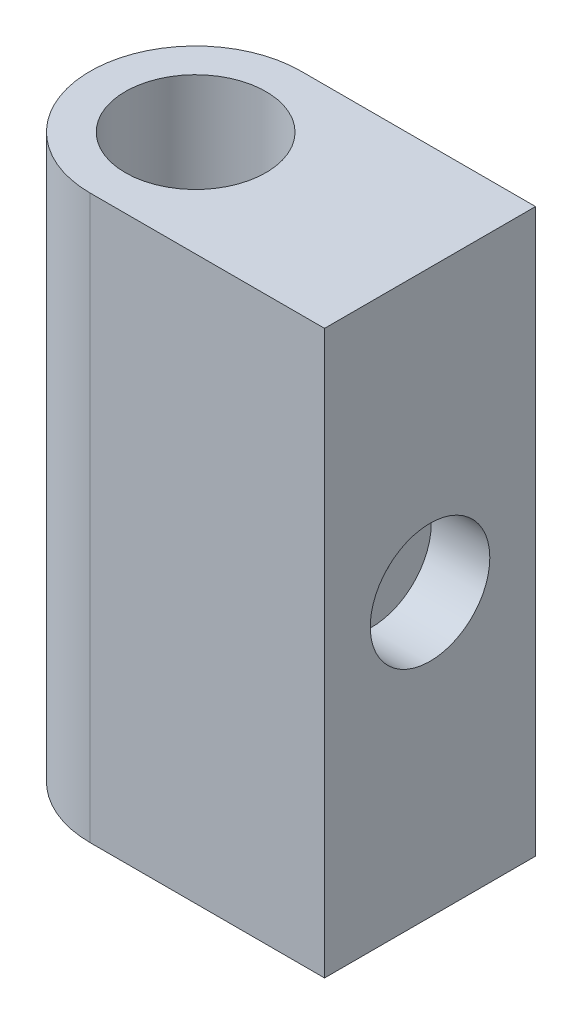
ISO-10303-21;
HEADER;
FILE_DESCRIPTION(('STEP AP214'),'2;1');
FILE_NAME('part.step','',(''),(''),'','','');
FILE_SCHEMA(('AUTOMOTIVE_DESIGN { 1 0 10303 214 1 1 1 1 }'));
ENDSEC;
DATA;
#1=APPLICATION_CONTEXT('core data for automotive mechanical design processes');
#2=APPLICATION_PROTOCOL_DEFINITION('international standard','automotive_design',2000,#1);
#3=PRODUCT_CONTEXT('',#1,'mechanical');
#4=PRODUCT('Part','Part','',(#3));
#5=PRODUCT_RELATED_PRODUCT_CATEGORY('part','',(#4));
#6=PRODUCT_DEFINITION_FORMATION('','',#4);
#7=PRODUCT_DEFINITION_CONTEXT('part definition',#1,'design');
#8=PRODUCT_DEFINITION('design','',#6,#7);
#9=PRODUCT_DEFINITION_SHAPE('','',#8);
#10=(LENGTH_UNIT() NAMED_UNIT(*) SI_UNIT(.MILLI.,.METRE.));
#11=(NAMED_UNIT(*) PLANE_ANGLE_UNIT() SI_UNIT($,.RADIAN.));
#12=(NAMED_UNIT(*) SI_UNIT($,.STERADIAN.) SOLID_ANGLE_UNIT());
#13=UNCERTAINTY_MEASURE_WITH_UNIT(LENGTH_MEASURE(1.E-05),#10,'distance_accuracy_value','');
#14=(GEOMETRIC_REPRESENTATION_CONTEXT(3) GLOBAL_UNCERTAINTY_ASSIGNED_CONTEXT((#13)) GLOBAL_UNIT_ASSIGNED_CONTEXT((#10,
#11,#12)) REPRESENTATION_CONTEXT('',''));
#15=CARTESIAN_POINT('',(0.,0.,0.));
#16=DIRECTION('',(0.,0.,1.));
#17=DIRECTION('',(1.,0.,0.));
#18=AXIS2_PLACEMENT_3D('',#15,#16,#17);
#19=CARTESIAN_POINT('',(0.,24.,0.));
#20=DIRECTION('',(0.,-1.,0.));
#21=DIRECTION('',(0.,0.,-1.));
#22=AXIS2_PLACEMENT_3D('',#19,#20,#21);
#23=CYLINDRICAL_SURFACE('',#22,3.);
#24=CARTESIAN_POINT('',(-1.58034806292791,12.,-2.55));
#25=CARTESIAN_POINT('',(-1.58036419946304,12.0869725091704,-2.54999414015116));
#26=CARTESIAN_POINT('',(-1.58769200710963,12.1741005734038,-2.54549174985861));
#27=CARTESIAN_POINT('',(-1.61542047962823,12.3454475487339,-2.52797552720362));
#28=CARTESIAN_POINT('',(-1.63586828604957,12.4296548103595,-2.51493099853644));
#29=CARTESIAN_POINT('',(-1.69662204343711,12.6270090888929,-2.4745219515144));
#30=CARTESIAN_POINT('',(-1.74162954326825,12.7379049501454,-2.44348254583797));
#31=CARTESIAN_POINT('',(-1.84180565920776,12.9505879350427,-2.36889651605155));
#32=CARTESIAN_POINT('',(-1.89700858715657,13.0523425223376,-2.32530737143315));
#33=CARTESIAN_POINT('',(-1.99738561764703,13.2229006789919,-2.23912482480946));
#34=CARTESIAN_POINT('',(-2.04159630272722,13.293561427916,-2.19903097305648));
#35=CARTESIAN_POINT('',(-2.13091018546103,13.430371461536,-2.11260324428197));
#36=CARTESIAN_POINT('',(-2.17601379550124,13.496518595858,-2.06626642382836));
#37=CARTESIAN_POINT('',(-2.31058712712745,13.688088145622,-1.91805105316987));
#38=CARTESIAN_POINT('',(-2.39951069021299,13.8069435879324,-1.80681277790663));
#39=CARTESIAN_POINT('',(-2.54873390809855,14.0003398401179,-1.58669773140099));
#40=CARTESIAN_POINT('',(-2.61103205522998,14.0788811543696,-1.4826625264938));
#41=CARTESIAN_POINT('',(-2.72551840222895,14.2209759051142,-1.25982347431062));
#42=CARTESIAN_POINT('',(-2.77772328201815,14.2845541077836,-1.14104453509618));
#43=CARTESIAN_POINT('',(-2.85987176343248,14.3836909558693,-0.912752643459822));
#44=CARTESIAN_POINT('',(-2.89212575672781,14.4222255216267,-0.805371360353293));
#45=CARTESIAN_POINT('',(-2.94486514313745,14.4849592886032,-0.583706489382501));
#46=CARTESIAN_POINT('',(-2.96535742739156,14.5091668841982,-0.46942698662763));
#47=CARTESIAN_POINT('',(-2.99297459214551,14.5417459502923,-0.236462337388017));
#48=CARTESIAN_POINT('',(-3.00003807979009,14.55004469121,-0.11775947462491));
#49=CARTESIAN_POINT('',(-2.99996162742121,14.5499549643238,0.119634171932145));
#50=CARTESIAN_POINT('',(-2.99282285098439,14.5415678635737,0.238324955918959));
#51=CARTESIAN_POINT('',(-2.96604164193072,14.5099731765271,0.463106167211607));
#52=CARTESIAN_POINT('',(-2.947363654086,14.487908331378,0.5694790400445));
#53=CARTESIAN_POINT('',(-2.89974014744232,14.4313012459549,0.776395076543693));
#54=CARTESIAN_POINT('',(-2.87079301529632,14.39675704508,0.876937321292325));
#55=CARTESIAN_POINT('',(-2.80172775890691,14.3136034210915,1.07820310125159));
#56=CARTESIAN_POINT('',(-2.76090639504525,14.2640966217854,1.17831015725028));
#57=CARTESIAN_POINT('',(-2.67164781377624,14.1543471329336,1.36871846861362));
#58=CARTESIAN_POINT('',(-2.62320464903093,14.0940960546218,1.45901197258852));
#59=CARTESIAN_POINT('',(-2.49549979742238,13.9322640083117,1.67168351645875));
#60=CARTESIAN_POINT('',(-2.41286445760448,13.8250003048137,1.78778005471743));
#61=CARTESIAN_POINT('',(-2.2853754061416,13.6513534831431,1.94464473600653));
#62=CARTESIAN_POINT('',(-2.24221904718785,13.59124137233,1.99411707100559));
#63=CARTESIAN_POINT('',(-2.15572260136032,13.4668447521452,2.08731763547995));
#64=CARTESIAN_POINT('',(-2.11238257819503,13.4025615939815,2.13104771141208));
#65=CARTESIAN_POINT('',(-2.00341502942419,13.2338370120478,2.23486793549749));
#66=CARTESIAN_POINT('',(-1.93843078553244,13.1265035682892,2.29098977210039));
#67=CARTESIAN_POINT('',(-1.81673475238016,12.9011226628781,2.38861834248635));
#68=CARTESIAN_POINT('',(-1.75999857974311,12.7831085267448,2.43016868978984));
#69=CARTESIAN_POINT('',(-1.68262391811637,12.5820188972546,2.48397281337336));
#70=CARTESIAN_POINT('',(-1.65643633785241,12.5025113099591,2.5013671315381));
#71=CARTESIAN_POINT('',(-1.61452027297985,12.3396034786515,2.52862718403891));
#72=CARTESIAN_POINT('',(-1.59876536247897,12.2562136468981,2.53851194946551));
#73=CARTESIAN_POINT('',(-1.58046035294427,12.086533908819,2.54995778816851));
#74=CARTESIAN_POINT('',(-1.57803571217018,12.000224115949,2.55143978255321));
#75=CARTESIAN_POINT('',(-1.58729052403136,11.8286319393117,2.54568781964496));
#76=CARTESIAN_POINT('',(-1.5989848560661,11.7433507352587,2.53844466730019));
#77=CARTESIAN_POINT('',(-1.63762205697747,11.5595749372591,2.51372173146763));
#78=CARTESIAN_POINT('',(-1.66717049711732,11.4618961902746,2.49446793201393));
#79=CARTESIAN_POINT('',(-1.7372930706236,11.2730454269352,2.44614212051156));
#80=CARTESIAN_POINT('',(-1.77790556207432,11.1818974672042,2.41703586410694));
#81=CARTESIAN_POINT('',(-1.85758829228604,11.0217146473851,2.3561469015554));
#82=CARTESIAN_POINT('',(-1.89565321826205,10.9516260569603,2.32575580449646));
#83=CARTESIAN_POINT('',(-1.97420442866811,10.8154838425205,2.25945976381318));
#84=CARTESIAN_POINT('',(-2.01469216211731,10.7494326818977,2.22355149997803));
#85=CARTESIAN_POINT('',(-2.09673763928908,10.6211462784056,2.14636211454001));
#86=CARTESIAN_POINT('',(-2.1382964334115,10.5589150009447,2.10507554400835));
#87=CARTESIAN_POINT('',(-2.2213967969776,10.4382654806659,2.01719020935599));
#88=CARTESIAN_POINT('',(-2.26293835441963,10.3798486522877,1.97058949208585));
#89=CARTESIAN_POINT('',(-2.34681121968081,10.2645897475262,1.87001151965115));
#90=CARTESIAN_POINT('',(-2.38910261925241,10.2079163738974,1.81580691257294));
#91=CARTESIAN_POINT('',(-2.47173984533933,10.0991458436709,1.7016084076666));
#92=CARTESIAN_POINT('',(-2.51208560639351,10.0470488409972,1.64161431525436));
#93=CARTESIAN_POINT('',(-2.58981236785219,9.94803381327182,1.51601725397902));
#94=CARTESIAN_POINT('',(-2.62720112576859,9.90110210135649,1.45042996751646));
#95=CARTESIAN_POINT('',(-2.69819604405755,9.81289101380707,1.31365125102563));
#96=CARTESIAN_POINT('',(-2.73180258431981,9.77161107041339,1.24246038504927));
#97=CARTESIAN_POINT('',(-2.80581326097518,9.6813837759313,1.06744707233282));
#98=CARTESIAN_POINT('',(-2.84415803025659,9.63521746106715,0.961267909894656));
#99=CARTESIAN_POINT('',(-2.90944425508272,9.55708670209745,0.740513735336554));
#100=CARTESIAN_POINT('',(-2.93639420295874,9.52511168061994,0.625945050736741));
#101=CARTESIAN_POINT('',(-2.97690522374502,9.47717782967745,0.390366991179606));
#102=CARTESIAN_POINT('',(-2.99038231223116,9.46131945490541,0.269322110848776));
#103=CARTESIAN_POINT('',(-3.00237107187923,9.44720795639877,0.0254776354400765));
#104=CARTESIAN_POINT('',(-3.00088785385781,9.44894882032243,-0.0973213460775337));
#105=CARTESIAN_POINT('',(-2.9839861115335,9.46885506259117,-0.328605422681673));
#106=CARTESIAN_POINT('',(-2.96991627209262,9.48543091284201,-0.437334737828452));
#107=CARTESIAN_POINT('',(-2.93076455520893,9.53179533902028,-0.649847757544597));
#108=CARTESIAN_POINT('',(-2.90568030624366,9.56158676041845,-0.753630391702031));
#109=CARTESIAN_POINT('',(-2.84480815407995,9.63444420332164,-0.958650140944277));
#110=CARTESIAN_POINT('',(-2.80859404467026,9.67804140667555,-1.05956906719022));
#111=CARTESIAN_POINT('',(-2.72808552575181,9.77610106540937,-1.25239532453187));
#112=CARTESIAN_POINT('',(-2.68378908412909,9.83056625361374,-1.34430038034483));
#113=CARTESIAN_POINT('',(-2.56635023104855,9.97726383497921,-1.56057255798071));
#114=CARTESIAN_POINT('',(-2.48958867143125,10.0750533807082,-1.67926106819597));
#115=CARTESIAN_POINT('',(-2.36943982687193,10.2342296507669,-1.84128567841008));
#116=CARTESIAN_POINT('',(-2.32844452670079,10.2895278989737,-1.89273671361723));
#117=CARTESIAN_POINT('',(-2.24563211718664,10.4040878012147,-1.99028052399672));
#118=CARTESIAN_POINT('',(-2.2038153496649,10.4633478303853,-2.03637547490268));
#119=CARTESIAN_POINT('',(-2.1194644097822,10.5869490016322,-2.12406363791348));
#120=CARTESIAN_POINT('',(-2.07693244367124,10.6513675669709,-2.16554952986191));
#121=CARTESIAN_POINT('',(-1.99314178431981,10.7843578337757,-2.2429077721262));
#122=CARTESIAN_POINT('',(-1.95188383787031,10.8529319038384,-2.2787768783834));
#123=CARTESIAN_POINT('',(-1.87239695227093,10.9941343811611,-2.34452026911305));
#124=CARTESIAN_POINT('',(-1.83415548087513,11.0667436158594,-2.37442024354952));
#125=CARTESIAN_POINT('',(-1.76267518771744,11.2165179415909,-2.4279551217156));
#126=CARTESIAN_POINT('',(-1.72942889323598,11.2936759819471,-2.45159942499794));
#127=CARTESIAN_POINT('',(-1.67093547176011,11.4523391728683,-2.49183280294748));
#128=CARTESIAN_POINT('',(-1.64564725353428,11.5338193663779,-2.50845827650457));
#129=CARTESIAN_POINT('',(-1.60646359524536,11.700526818483,-2.53374112382543));
#130=CARTESIAN_POINT('',(-1.592519180622,11.7857362776074,-2.5424327703482));
#131=CARTESIAN_POINT('',(-1.58382391207498,11.8929524331979,-2.54784269146493));
#132=CARTESIAN_POINT('',(-1.58252438633713,11.9143282797017,-2.54865023577574));
#133=CARTESIAN_POINT('',(-1.58078436228831,11.9571329254987,-2.54972968127438));
#134=CARTESIAN_POINT('',(-1.58034408535745,11.9785617370146,-2.55000144442171));
#135=CARTESIAN_POINT('',(-1.58034806292791,12.,-2.55));
#136=B_SPLINE_CURVE_WITH_KNOTS('',3,(#24,#25,#26,#27,#28,#29,#30,#31,#32,#33,#34,#35,#36,#37,
#38,#39,#40,#41,#42,#43,#44,#45,#46,#47,#48,#49,#50,#51,#52,#53,#54,#55,#56,#57,#58,#59,#60,#61,
#62,#63,#64,#65,#66,#67,#68,#69,#70,#71,#72,#73,#74,#75,#76,#77,#78,#79,#80,#81,#82,#83,#84,#85,
#86,#87,#88,#89,#90,#91,#92,#93,#94,#95,#96,#97,#98,#99,#100,#101,#102,#103,#104,#105,#106,#107,
#108,#109,#110,#111,#112,#113,#114,#115,#116,#117,#118,#119,#120,#121,#122,#123,#124,#125,#126,
#127,#128,#129,#130,#131,#132,#133,#134,#135),.UNSPECIFIED.,.T.,.F.,(4,2,2,2,2,2,2,2,2,2,2,2,2,
2,2,2,2,2,2,2,2,2,2,2,2,2,2,2,2,2,2,2,2,2,2,2,2,2,2,2,2,2,2,2,2,2,2,2,2,2,2,2,2,2,2,4),(0.,
0.260819128326951,0.52258069575937,0.891410874326817,1.26150571814708,1.53864791160456,
1.81592123220816,2.36930574695163,2.80121725762468,3.23240878231247,3.58661852041184,
3.94062051599184,4.29623705803741,4.65182446599129,4.98109624827447,5.31041978414753,
5.66582934377591,6.02151761979384,6.55351452111874,6.82035359373294,7.08710665146988,
7.49834657584164,7.90834490812674,8.16402802886294,8.4190610028104,8.67649017084262,
8.93419086976233,9.24400938072309,9.55491598301231,9.81064836850566,10.0665352599998,
10.3226834445184,10.578926078445,10.8459117516694,11.1129064013865,11.3791756175755,
11.6454180655064,12.0097823154592,12.3738745313499,12.7402224592469,13.1064452377258,
13.4375820691386,13.7687902329088,14.1147202205119,14.4607373042961,14.9733716246835,
15.2310094682785,15.4885422863397,15.7511789207504,16.0139666898012,16.2755978607065,
16.5368336519929,16.7966975471968,17.0554334883908,17.1197074648628,17.1839979989411),.UNSPECIFIED.);
#137=CARTESIAN_POINT('',(-1.58034806292791,12.,-2.55));
#138=VERTEX_POINT('',#137);
#139=EDGE_CURVE('E182',#138,#138,#136,.T.);
#140=ORIENTED_EDGE('',*,*,#139,.F.);
#141=EDGE_LOOP('',(#140));
#142=FACE_BOUND('',#141,.T.);
#143=CARTESIAN_POINT('',(0.,0.,0.));
#144=DIRECTION('',(0.,1.,0.));
#145=DIRECTION('',(0.,0.,1.));
#146=AXIS2_PLACEMENT_3D('',#143,#144,#145);
#147=CIRCLE('',#146,3.);
#148=CARTESIAN_POINT('',(0.,0.,3.));
#149=VERTEX_POINT('',#148);
#150=EDGE_CURVE('E122',#149,#149,#147,.T.);
#151=ORIENTED_EDGE('',*,*,#150,.F.);
#152=EDGE_LOOP('',(#151));
#153=FACE_BOUND('',#152,.T.);
#154=CARTESIAN_POINT('',(0.,24.,0.));
#155=DIRECTION('',(0.,1.,0.));
#156=DIRECTION('',(0.,0.,1.));
#157=AXIS2_PLACEMENT_3D('',#154,#155,#156);
#158=CIRCLE('',#157,3.);
#159=CARTESIAN_POINT('',(0.,24.,3.));
#160=VERTEX_POINT('',#159);
#161=EDGE_CURVE('E107',#160,#160,#158,.T.);
#162=ORIENTED_EDGE('',*,*,#161,.T.);
#163=EDGE_LOOP('',(#162));
#164=FACE_BOUND('',#163,.T.);
#165=CARTESIAN_POINT('',(1.58034806292791,12.,2.55));
#166=CARTESIAN_POINT('',(1.58036419946304,11.9130274908296,2.54999414015116));
#167=CARTESIAN_POINT('',(1.58769200710963,11.8258994265962,2.54549174985861));
#168=CARTESIAN_POINT('',(1.61542047962822,11.6545524512661,2.52797552720362));
#169=CARTESIAN_POINT('',(1.63586828604957,11.5703451896405,2.51493099853644));
#170=CARTESIAN_POINT('',(1.6966220434371,11.3729909111072,2.47452195151441));
#171=CARTESIAN_POINT('',(1.74162954326825,11.2620950498546,2.44348254583797));
#172=CARTESIAN_POINT('',(1.84180565920776,11.0494120649573,2.36889651605155));
#173=CARTESIAN_POINT('',(1.89700858715657,10.9476574776624,2.32530737143315));
#174=CARTESIAN_POINT('',(1.99738561764703,10.7770993210081,2.23912482480947));
#175=CARTESIAN_POINT('',(2.04159630272722,10.706438572084,2.19903097305648));
#176=CARTESIAN_POINT('',(2.13091018546102,10.569628538464,2.11260324428197));
#177=CARTESIAN_POINT('',(2.17601379550124,10.503481404142,2.06626642382836));
#178=CARTESIAN_POINT('',(2.31058712712745,10.311911854378,1.91805105316988));
#179=CARTESIAN_POINT('',(2.39951069021299,10.1930564120676,1.80681277790663));
#180=CARTESIAN_POINT('',(2.54873390809855,9.9996601598821,1.586697731401));
#181=CARTESIAN_POINT('',(2.61103205522998,9.92111884563041,1.4826625264938));
#182=CARTESIAN_POINT('',(2.72551840222895,9.77902409488583,1.25982347431062));
#183=CARTESIAN_POINT('',(2.77772328201815,9.71544589221641,1.14104453509618));
#184=CARTESIAN_POINT('',(2.85987176343248,9.61630904413066,0.912752643459825));
#185=CARTESIAN_POINT('',(2.89212575672781,9.57777447837326,0.805371360353296));
#186=CARTESIAN_POINT('',(2.94486514313745,9.51504071139675,0.583706489382504));
#187=CARTESIAN_POINT('',(2.96535742739156,9.49083311580176,0.469426986627632));
#188=CARTESIAN_POINT('',(2.99297459214551,9.45825404970765,0.236462337388019));
#189=CARTESIAN_POINT('',(3.00003807979009,9.44995530879003,0.117759474624911));
#190=CARTESIAN_POINT('',(2.99996162742121,9.45004503567616,-0.119634171932144));
#191=CARTESIAN_POINT('',(2.99282285098439,9.45843213642634,-0.238324955918958));
#192=CARTESIAN_POINT('',(2.96604164193072,9.49002682347287,-0.463106167211606));
#193=CARTESIAN_POINT('',(2.947363654086,9.51209166862195,-0.5694790400445));
#194=CARTESIAN_POINT('',(2.89974014744232,9.56869875404513,-0.776395076543693));
#195=CARTESIAN_POINT('',(2.87079301529632,9.60324295491998,-0.876937321292324));
#196=CARTESIAN_POINT('',(2.80172775890691,9.68639657890847,-1.07820310125159));
#197=CARTESIAN_POINT('',(2.76090639504525,9.73590337821464,-1.17831015725028));
#198=CARTESIAN_POINT('',(2.67164781377624,9.84565286706638,-1.36871846861362));
#199=CARTESIAN_POINT('',(2.62320464903093,9.90590394537823,-1.45901197258852));
#200=CARTESIAN_POINT('',(2.49549979742238,10.0677359916883,-1.67168351645875));
#201=CARTESIAN_POINT('',(2.41286445760448,10.1749996951863,-1.78778005471743));
#202=CARTESIAN_POINT('',(2.2853754061416,10.3486465168569,-1.94464473600653));
#203=CARTESIAN_POINT('',(2.24221904718785,10.40875862767,-1.99411707100559));
#204=CARTESIAN_POINT('',(2.15572260136032,10.5331552478548,-2.08731763547995));
#205=CARTESIAN_POINT('',(2.11238257819503,10.5974384060185,-2.13104771141208));
#206=CARTESIAN_POINT('',(2.00341502942419,10.7661629879522,-2.23486793549749));
#207=CARTESIAN_POINT('',(1.93843078553244,10.8734964317108,-2.29098977210038));
#208=CARTESIAN_POINT('',(1.81673475238016,11.0988773371219,-2.38861834248635));
#209=CARTESIAN_POINT('',(1.75999857974311,11.2168914732552,-2.43016868978984));
#210=CARTESIAN_POINT('',(1.68262391811638,11.4179811027454,-2.48397281337336));
#211=CARTESIAN_POINT('',(1.65643633785241,11.4974886900409,-2.5013671315381));
#212=CARTESIAN_POINT('',(1.61452027297985,11.6603965213485,-2.52862718403891));
#213=CARTESIAN_POINT('',(1.59876536247897,11.7437863531019,-2.5385119494655));
#214=CARTESIAN_POINT('',(1.58046035294427,11.913466091181,-2.54995778816851));
#215=CARTESIAN_POINT('',(1.57803571217019,11.9997758840511,-2.5514397825532));
#216=CARTESIAN_POINT('',(1.58729052403136,12.1713680606884,-2.54568781964496));
#217=CARTESIAN_POINT('',(1.59898485606611,12.2566492647413,-2.53844466730018));
#218=CARTESIAN_POINT('',(1.63762205697747,12.4404250627409,-2.51372173146763));
#219=CARTESIAN_POINT('',(1.66717049711733,12.5381038097254,-2.49446793201392));
#220=CARTESIAN_POINT('',(1.7372930706236,12.7269545730649,-2.44614212051156));
#221=CARTESIAN_POINT('',(1.77790556207432,12.8181025327958,-2.41703586410693));
#222=CARTESIAN_POINT('',(1.85758829228604,12.9782853526149,-2.3561469015554));
#223=CARTESIAN_POINT('',(1.89565321826206,13.0483739430397,-2.32575580449645));
#224=CARTESIAN_POINT('',(1.97420442866811,13.1845161574795,-2.25945976381318));
#225=CARTESIAN_POINT('',(2.01469216211731,13.2505673181024,-2.22355149997802));
#226=CARTESIAN_POINT('',(2.09673763928908,13.3788537215944,-2.14636211454));
#227=CARTESIAN_POINT('',(2.1382964334115,13.4410849990553,-2.10507554400835));
#228=CARTESIAN_POINT('',(2.2213967969776,13.5617345193341,-2.01719020935598));
#229=CARTESIAN_POINT('',(2.26293835441964,13.6201513477123,-1.97058949208584));
#230=CARTESIAN_POINT('',(2.34681121968082,13.7354102524738,-1.87001151965114));
#231=CARTESIAN_POINT('',(2.38910261925242,13.7920836261026,-1.81580691257293));
#232=CARTESIAN_POINT('',(2.47173984533934,13.9008541563291,-1.70160840766659));
#233=CARTESIAN_POINT('',(2.51208560639352,13.9529511590028,-1.64161431525435));
#234=CARTESIAN_POINT('',(2.5898123678522,14.0519661867282,-1.51601725397901));
#235=CARTESIAN_POINT('',(2.6272011257686,14.0988978986435,-1.45042996751645));
#236=CARTESIAN_POINT('',(2.69819604405755,14.1871089861929,-1.31365125102562));
#237=CARTESIAN_POINT('',(2.73180258431981,14.2283889295866,-1.24246038504926));
#238=CARTESIAN_POINT('',(2.80581326097519,14.3186162240687,-1.06744707233281));
#239=CARTESIAN_POINT('',(2.84415803025659,14.3647825389328,-0.961267909894647));
#240=CARTESIAN_POINT('',(2.90944425508273,14.4429132979026,-0.740513735336545));
#241=CARTESIAN_POINT('',(2.93639420295874,14.4748883193801,-0.625945050736732));
#242=CARTESIAN_POINT('',(2.97690522374502,14.5228221703226,-0.390366991179597));
#243=CARTESIAN_POINT('',(2.99038231223116,14.5386805450946,-0.269322110848767));
#244=CARTESIAN_POINT('',(3.00237107187923,14.5527920436012,-0.0254776354400677));
#245=CARTESIAN_POINT('',(3.00088785385781,14.5510511796776,0.0973213460775418));
#246=CARTESIAN_POINT('',(2.9839861115335,14.5311449374088,0.328605422681681));
#247=CARTESIAN_POINT('',(2.96991627209262,14.514569087158,0.437334737828461));
#248=CARTESIAN_POINT('',(2.93076455520893,14.4682046609797,0.649847757544605));
#249=CARTESIAN_POINT('',(2.90568030624366,14.4384132395816,0.753630391702038));
#250=CARTESIAN_POINT('',(2.84480815407995,14.3655557966784,0.958650140944282));
#251=CARTESIAN_POINT('',(2.80859404467025,14.3219585933244,1.05956906719023));
#252=CARTESIAN_POINT('',(2.7280855257518,14.2238989345906,1.25239532453188));
#253=CARTESIAN_POINT('',(2.68378908412909,14.1694337463863,1.34430038034484));
#254=CARTESIAN_POINT('',(2.56635023104855,14.0227361650208,1.56057255798072));
#255=CARTESIAN_POINT('',(2.48958867143124,13.9249466192918,1.67926106819598));
#256=CARTESIAN_POINT('',(2.36943982687192,13.7657703492331,1.84128567841008));
#257=CARTESIAN_POINT('',(2.32844452670079,13.7104721010263,1.89273671361724));
#258=CARTESIAN_POINT('',(2.24563211718663,13.5959121987853,1.99028052399672));
#259=CARTESIAN_POINT('',(2.20381534966489,13.5366521696147,2.03637547490269));
#260=CARTESIAN_POINT('',(2.11946440978219,13.4130509983678,2.12406363791348));
#261=CARTESIAN_POINT('',(2.07693244367124,13.3486324330291,2.16554952986192));
#262=CARTESIAN_POINT('',(1.9931417843198,13.2156421662242,2.24290777212621));
#263=CARTESIAN_POINT('',(1.9518838378703,13.1470680961615,2.2787768783834));
#264=CARTESIAN_POINT('',(1.87239695227092,13.0058656188389,2.34452026911306));
#265=CARTESIAN_POINT('',(1.83415548087513,12.9332563841406,2.37442024354953));
#266=CARTESIAN_POINT('',(1.76267518771743,12.7834820584091,2.42795512171561));
#267=CARTESIAN_POINT('',(1.72942889323598,12.7063240180529,2.45159942499794));
#268=CARTESIAN_POINT('',(1.6709354717601,12.5476608271317,2.49183280294749));
#269=CARTESIAN_POINT('',(1.64564725353427,12.4661806336221,2.50845827650457));
#270=CARTESIAN_POINT('',(1.60646359524535,12.299473181517,2.53374112382544));
#271=CARTESIAN_POINT('',(1.59251918062199,12.2142637223926,2.5424327703482));
#272=CARTESIAN_POINT('',(1.58382391207497,12.1070475668021,2.54784269146494));
#273=CARTESIAN_POINT('',(1.58252438633713,12.0856717202983,2.54865023577574));
#274=CARTESIAN_POINT('',(1.5807843622883,12.0428670745013,2.54972968127438));
#275=CARTESIAN_POINT('',(1.58034408535745,12.0214382629854,2.55000144442171));
#276=CARTESIAN_POINT('',(1.58034806292791,12.,2.55));
#277=B_SPLINE_CURVE_WITH_KNOTS('',3,(#165,#166,#167,#168,#169,#170,#171,#172,#173,#174,#175,
#176,#177,#178,#179,#180,#181,#182,#183,#184,#185,#186,#187,#188,#189,#190,#191,#192,#193,#194,
#195,#196,#197,#198,#199,#200,#201,#202,#203,#204,#205,#206,#207,#208,#209,#210,#211,#212,#213,
#214,#215,#216,#217,#218,#219,#220,#221,#222,#223,#224,#225,#226,#227,#228,#229,#230,#231,#232,
#233,#234,#235,#236,#237,#238,#239,#240,#241,#242,#243,#244,#245,#246,#247,#248,#249,#250,#251,
#252,#253,#254,#255,#256,#257,#258,#259,#260,#261,#262,#263,#264,#265,#266,#267,#268,#269,#270,
#271,#272,#273,#274,#275,#276),.UNSPECIFIED.,.T.,.F.,(4,2,2,2,2,2,2,2,2,2,2,2,2,2,2,2,2,2,2,2,2,
2,2,2,2,2,2,2,2,2,2,2,2,2,2,2,2,2,2,2,2,2,2,2,2,2,2,2,2,2,2,2,2,2,2,4),(0.,0.260819128326951,
0.52258069575937,0.891410874326813,1.26150571814707,1.53864791160456,1.81592123220816,
2.36930574695162,2.80121725762468,3.23240878231247,3.58661852041184,3.94062051599184,
4.29623705803741,4.65182446599129,4.98109624827448,5.31041978414753,5.66582934377591,
6.02151761979384,6.55351452111874,6.82035359373295,7.08710665146987,7.49834657584164,
7.90834490812674,8.16402802886295,8.41906100281041,8.67649017084262,8.93419086976233,
9.2440093807231,9.55491598301231,9.81064836850567,10.0665352599998,10.3226834445184,
10.578926078445,10.8459117516694,11.1129064013865,11.3791756175755,11.6454180655064,
12.0097823154592,12.3738745313499,12.7402224592469,13.1064452377258,13.4375820691386,
13.7687902329089,14.1147202205119,14.4607373042961,14.9733716246835,15.2310094682785,
15.4885422863397,15.7511789207504,16.0139666898012,16.2755978607065,16.5368336519929,
16.7966975471968,17.0554334883908,17.1197074648628,17.1839979989411),.UNSPECIFIED.);
#278=CARTESIAN_POINT('',(1.58034806292791,12.,2.55));
#279=VERTEX_POINT('',#278);
#280=EDGE_CURVE('E129',#279,#279,#277,.T.);
#281=ORIENTED_EDGE('',*,*,#280,.T.);
#282=EDGE_LOOP('',(#281));
#283=FACE_BOUND('',#282,.T.);
#284=ADVANCED_FACE('F37',(#142,#153,#164,#283),#23,.F.);
#285=CARTESIAN_POINT('',(0.,24.,0.));
#286=DIRECTION('',(0.,-1.,0.));
#287=DIRECTION('',(0.,0.,-1.));
#288=AXIS2_PLACEMENT_3D('',#285,#286,#287);
#289=CYLINDRICAL_SURFACE('',#288,4.5);
#290=CARTESIAN_POINT('',(-3.70776212829248,12.,-2.55));
#291=CARTESIAN_POINT('',(-3.70776771050148,12.1299719700314,-2.54999632129783));
#292=CARTESIAN_POINT('',(-3.71469948106076,12.2599709444518,-2.54000070622124));
#293=CARTESIAN_POINT('',(-3.74128343267017,12.5157102838063,-2.50066578929422));
#294=CARTESIAN_POINT('',(-3.76094946635634,12.6414458539685,-2.47130542135553));
#295=CARTESIAN_POINT('',(-3.80994478968396,12.8844767687794,-2.39506494708127));
#296=CARTESIAN_POINT('',(-3.8392122601377,13.0018204071377,-2.34829666944806));
#297=CARTESIAN_POINT('',(-3.90400593578046,13.2269523597337,-2.23892165597188));
#298=CARTESIAN_POINT('',(-3.93953412737534,13.3347376249198,-2.17630989053944));
#299=CARTESIAN_POINT('',(-4.01748971556501,13.5504550159362,-2.02914391169432));
#300=CARTESIAN_POINT('',(-4.06024798561825,13.6571506181308,-1.94295197687383));
#301=CARTESIAN_POINT('',(-4.1451918307377,13.855575184145,-1.75444676426652));
#302=CARTESIAN_POINT('',(-4.1873770261454,13.9472946310945,-1.65212331595534));
#303=CARTESIAN_POINT('',(-4.27108093814219,14.1215575137034,-1.42271035877684));
#304=CARTESIAN_POINT('',(-4.31217448634784,14.2024594590668,-1.29420373430705));
#305=CARTESIAN_POINT('',(-4.38450680771352,14.3409165455732,-1.02263345606506));
#306=CARTESIAN_POINT('',(-4.41575358003803,14.3984906483342,-0.87958174381149));
#307=CARTESIAN_POINT('',(-4.46243813477209,14.4833429750974,-0.596183411003237));
#308=CARTESIAN_POINT('',(-4.47901732979772,14.5128261229785,-0.456689645794371));
#309=CARTESIAN_POINT('',(-4.49886828874856,14.5480463467142,-0.173841808244434));
#310=CARTESIAN_POINT('',(-4.50215086604446,14.5538027182515,-0.0304909681921819));
#311=CARTESIAN_POINT('',(-4.49544934864206,14.5419616221236,0.238886343304037));
#312=CARTESIAN_POINT('',(-4.48689703014731,14.5268848377137,0.365070032994069));
#313=CARTESIAN_POINT('',(-4.45982548503438,14.478496642566,0.612762384782748));
#314=CARTESIAN_POINT('',(-4.44130552616763,14.4451838921639,0.73427070271376));
#315=CARTESIAN_POINT('',(-4.39571282617021,14.3613630376998,0.970753704574613));
#316=CARTESIAN_POINT('',(-4.36856188714211,14.3106973754203,1.0856568390423));
#317=CARTESIAN_POINT('',(-4.30797128901045,14.1939921759005,1.30552948908849));
#318=CARTESIAN_POINT('',(-4.2745297415106,14.1279480207253,1.41049600750423));
#319=CARTESIAN_POINT('',(-4.19988380593707,13.9739707655593,1.62009022904338));
#320=CARTESIAN_POINT('',(-4.15822949466844,13.8844151862086,1.72336538194698));
#321=CARTESIAN_POINT('',(-4.07388496708945,13.6901768903602,1.91425630520402));
#322=CARTESIAN_POINT('',(-4.03119357326633,13.58547623932,2.00185323057996));
#323=CARTESIAN_POINT('',(-3.94485181954685,13.3517679465202,2.16741200921741));
#324=CARTESIAN_POINT('',(-3.90151020592121,13.2213876100113,2.24361476046588));
#325=CARTESIAN_POINT('',(-3.82451804678716,12.9469096583884,2.37249694358464));
#326=CARTESIAN_POINT('',(-3.7908505368199,12.8028366526205,2.42521764390688));
#327=CARTESIAN_POINT('',(-3.7449512531177,12.5385798634154,2.49533150896191));
#328=CARTESIAN_POINT('',(-3.7295971584934,12.4203389162455,2.5180112136772));
#329=CARTESIAN_POINT('',(-3.71026585091377,12.1809610869989,2.54641751663039));
#330=CARTESIAN_POINT('',(-3.706278082125,12.059826997282,2.55215984467344));
#331=CARTESIAN_POINT('',(-3.71025043013194,11.8181271599786,2.54637963465466));
#332=CARTESIAN_POINT('',(-3.71821628851416,11.6975617134311,2.53484879992256));
#333=CARTESIAN_POINT('',(-3.74495996708559,11.4604169814771,2.49516115547525));
#334=CARTESIAN_POINT('',(-3.76374554250474,11.3438406188822,2.46699241987067));
#335=CARTESIAN_POINT('',(-3.8100913699905,11.1157019598806,2.39479678474734));
#336=CARTESIAN_POINT('',(-3.83777459520863,11.0042365616031,2.35054643087416));
#337=CARTESIAN_POINT('',(-3.89889245939799,10.7898583813261,2.24771224974778));
#338=CARTESIAN_POINT('',(-3.93232947099667,10.6869491536112,2.18912250528777));
#339=CARTESIAN_POINT('',(-4.00779146722527,10.4747856679282,2.04816694054203));
#340=CARTESIAN_POINT('',(-4.05032617123031,10.3672515835742,1.96347885752379));
#341=CARTESIAN_POINT('',(-4.13514025408051,10.1669352961665,1.77792989312311));
#342=CARTESIAN_POINT('',(-4.177419399282,10.0741650631021,1.6770560206138));
#343=CARTESIAN_POINT('',(-4.26174964215565,9.89723409180809,1.45032993459853));
#344=CARTESIAN_POINT('',(-4.3033949536854,9.81473660880694,1.32301338205894));
#345=CARTESIAN_POINT('',(-4.37714856426685,9.67285430532271,1.05357331376197));
#346=CARTESIAN_POINT('',(-4.40926451577783,9.61345092738604,0.911461803524797));
#347=CARTESIAN_POINT('',(-4.45796937691276,9.52467208525786,0.628770256509324));
#348=CARTESIAN_POINT('',(-4.47561937522081,9.49322620927548,0.489028330754318));
#349=CARTESIAN_POINT('',(-4.49756113933066,9.4542527844905,0.205256594451576));
#350=CARTESIAN_POINT('',(-4.50186422332869,9.44670496999562,0.0612305215740264));
#351=CARTESIAN_POINT('',(-4.49693022777623,9.45542231753125,-0.209390061724575));
#352=CARTESIAN_POINT('',(-4.48917549983131,9.46908022193783,-0.336106487488377));
#353=CARTESIAN_POINT('',(-4.46355524324247,9.51480696459161,-0.585095033796495));
#354=CARTESIAN_POINT('',(-4.44568913124876,9.54687686507217,-0.707366897490288));
#355=CARTESIAN_POINT('',(-4.40133985762484,9.62819599441714,-0.944928019291135));
#356=CARTESIAN_POINT('',(-4.37482067886894,9.67751709170069,-1.06018566046281));
#357=CARTESIAN_POINT('',(-4.31534914249585,9.79158327126149,-1.28095689989258));
#358=CARTESIAN_POINT('',(-4.28239496183245,9.85633272556421,-1.38646772435493));
#359=CARTESIAN_POINT('',(-4.20866390120181,10.0074698141105,-1.59716315767326));
#360=CARTESIAN_POINT('',(-4.16742542703399,10.0954521777832,-1.70104155290409));
#361=CARTESIAN_POINT('',(-4.08363692740246,10.2865331762369,-1.89339443547156));
#362=CARTESIAN_POINT('',(-4.04108538702038,10.3896498292599,-1.98185028285083));
#363=CARTESIAN_POINT('',(-3.95450405818071,10.620440686827,-2.14981154155493));
#364=CARTESIAN_POINT('',(-3.91075706983626,10.7495422721838,-2.22751803100313));
#365=CARTESIAN_POINT('',(-3.83247542889478,11.0216351712914,-2.35967613514881));
#366=CARTESIAN_POINT('',(-3.79792441718972,11.1646011941983,-2.41416915042731));
#367=CARTESIAN_POINT('',(-3.75076969440163,11.4232645911085,-2.48658300977721));
#368=CARTESIAN_POINT('',(-3.73482882445325,11.5367491458727,-2.51026065495828));
#369=CARTESIAN_POINT('',(-3.71332666398858,11.7668169147831,-2.54196457762069));
#370=CARTESIAN_POINT('',(-3.70775712029714,11.8833975901328,-2.55000330029266));
#371=CARTESIAN_POINT('',(-3.70776212829248,12.,-2.55));
#372=B_SPLINE_CURVE_WITH_KNOTS('',3,(#290,#291,#292,#293,#294,#295,#296,#297,#298,#299,#300,
#301,#302,#303,#304,#305,#306,#307,#308,#309,#310,#311,#312,#313,#314,#315,#316,#317,#318,#319,
#320,#321,#322,#323,#324,#325,#326,#327,#328,#329,#330,#331,#332,#333,#334,#335,#336,#337,#338,
#339,#340,#341,#342,#343,#344,#345,#346,#347,#348,#349,#350,#351,#352,#353,#354,#355,#356,#357,
#358,#359,#360,#361,#362,#363,#364,#365,#366,#367,#368,#369,#370,#371),.UNSPECIFIED.,.T.,.F.,(4,
2,2,2,2,2,2,2,2,2,2,2,2,2,2,2,2,2,2,2,2,2,2,2,2,2,2,2,2,2,2,2,2,2,2,2,2,2,2,2,4),(0.,
0.38942874921676,0.779281841649118,1.16667256104249,1.55418641405803,1.98347090216669,
2.41302713407004,2.88244754916853,3.35148563514675,3.77960258225196,4.20737129660307,
4.58767063994771,4.96799792487653,5.35187424638621,5.73586598929594,6.16283103229744,
6.59030588342411,7.05925061963049,7.52736792686428,7.88988255419473,8.25206040666365,
8.61441227670541,8.9770241928656,9.34488032460477,9.71288851034851,10.1411547791282,
10.5697665207588,11.0392285928328,11.5083126412837,11.9387569950313,12.3688362316165,
12.7500680474466,13.1313218596887,13.5141832725456,13.8971533084223,14.3221465918933,
14.747650021601,15.2160116188843,15.6835343732499,16.0331829121596,16.382553092663),.UNSPECIFIED.);
#373=CARTESIAN_POINT('',(-3.70776212829248,12.,-2.55));
#374=VERTEX_POINT('',#373);
#375=EDGE_CURVE('E42',#374,#374,#372,.T.);
#376=ORIENTED_EDGE('',*,*,#375,.T.);
#377=EDGE_LOOP('',(#376));
#378=FACE_BOUND('',#377,.T.);
#379=CARTESIAN_POINT('',(0.,0.,0.));
#380=DIRECTION('',(0.,1.,0.));
#381=DIRECTION('',(0.,0.,1.));
#382=AXIS2_PLACEMENT_3D('',#379,#380,#381);
#383=CIRCLE('',#382,4.5);
#384=CARTESIAN_POINT('',(0.,0.,-4.5));
#385=VERTEX_POINT('',#384);
#386=CARTESIAN_POINT('',(0.,0.,4.5));
#387=VERTEX_POINT('',#386);
#388=EDGE_CURVE('E113',#385,#387,#383,.T.);
#389=ORIENTED_EDGE('',*,*,#388,.T.);
#390=DIRECTION('',(0.,-1.,0.));
#391=VECTOR('',#390,1.);
#392=CARTESIAN_POINT('',(0.,24.,4.5));
#393=LINE('',#392,#391);
#394=CARTESIAN_POINT('',(0.,24.,4.5));
#395=VERTEX_POINT('',#394);
#396=EDGE_CURVE('E12',#395,#387,#393,.T.);
#397=ORIENTED_EDGE('',*,*,#396,.F.);
#398=CARTESIAN_POINT('',(0.,24.,0.));
#399=DIRECTION('',(0.,1.,0.));
#400=DIRECTION('',(0.,0.,1.));
#401=AXIS2_PLACEMENT_3D('',#398,#399,#400);
#402=CIRCLE('',#401,4.5);
#403=CARTESIAN_POINT('',(0.,24.,-4.5));
#404=VERTEX_POINT('',#403);
#405=EDGE_CURVE('E95',#404,#395,#402,.T.);
#406=ORIENTED_EDGE('',*,*,#405,.F.);
#407=DIRECTION('',(0.,-1.,0.));
#408=VECTOR('',#407,1.);
#409=CARTESIAN_POINT('',(0.,24.,-4.5));
#410=LINE('',#409,#408);
#411=EDGE_CURVE('E61',#404,#385,#410,.T.);
#412=ORIENTED_EDGE('',*,*,#411,.T.);
#413=EDGE_LOOP('',(#389,#397,#406,#412));
#414=FACE_BOUND('',#413,.T.);
#415=ADVANCED_FACE('F39',(#378,#414),#289,.T.);
#416=CARTESIAN_POINT('',(0.,24.,4.5));
#417=DIRECTION('',(0.,0.,-1.));
#418=DIRECTION('',(-1.,0.,0.));
#419=AXIS2_PLACEMENT_3D('',#416,#417,#418);
#420=PLANE('',#419);
#421=DIRECTION('',(1.,0.,0.));
#422=VECTOR('',#421,1.);
#423=CARTESIAN_POINT('',(0.,0.,4.5));
#424=LINE('',#423,#422);
#425=CARTESIAN_POINT('',(10.,0.,4.5));
#426=VERTEX_POINT('',#425);
#427=EDGE_CURVE('E100',#387,#426,#424,.T.);
#428=ORIENTED_EDGE('',*,*,#427,.T.);
#429=DIRECTION('',(0.,-1.,0.));
#430=VECTOR('',#429,1.);
#431=CARTESIAN_POINT('',(10.,24.,4.5));
#432=LINE('',#431,#430);
#433=CARTESIAN_POINT('',(10.,24.,4.5));
#434=VERTEX_POINT('',#433);
#435=EDGE_CURVE('E52',#434,#426,#432,.T.);
#436=ORIENTED_EDGE('',*,*,#435,.F.);
#437=DIRECTION('',(1.,0.,0.));
#438=VECTOR('',#437,1.);
#439=CARTESIAN_POINT('',(0.,24.,4.5));
#440=LINE('',#439,#438);
#441=EDGE_CURVE('E86',#395,#434,#440,.T.);
#442=ORIENTED_EDGE('',*,*,#441,.F.);
#443=ORIENTED_EDGE('',*,*,#396,.T.);
#444=EDGE_LOOP('',(#428,#436,#442,#443));
#445=FACE_BOUND('',#444,.T.);
#446=ADVANCED_FACE('F99',(#445),#420,.F.);
#447=CARTESIAN_POINT('',(10.,24.,0.));
#448=DIRECTION('',(1.,0.,0.));
#449=DIRECTION('',(0.,0.,-1.));
#450=AXIS2_PLACEMENT_3D('',#447,#448,#449);
#451=PLANE('',#450);
#452=CARTESIAN_POINT('',(10.,12.,0.));
#453=DIRECTION('',(1.,0.,0.));
#454=DIRECTION('',(0.,0.,-1.));
#455=AXIS2_PLACEMENT_3D('',#452,#453,#454);
#456=CIRCLE('',#455,2.55);
#457=CARTESIAN_POINT('',(10.,12.,-2.55));
#458=VERTEX_POINT('',#457);
#459=EDGE_CURVE('E199',#458,#458,#456,.T.);
#460=ORIENTED_EDGE('',*,*,#459,.F.);
#461=EDGE_LOOP('',(#460));
#462=FACE_BOUND('',#461,.T.);
#463=DIRECTION('',(0.,0.,1.));
#464=VECTOR('',#463,1.);
#465=CARTESIAN_POINT('',(10.,0.,0.));
#466=LINE('',#465,#464);
#467=CARTESIAN_POINT('',(10.,0.,-4.5));
#468=VERTEX_POINT('',#467);
#469=EDGE_CURVE('E117',#468,#426,#466,.T.);
#470=ORIENTED_EDGE('',*,*,#469,.F.);
#471=DIRECTION('',(0.,-1.,0.));
#472=VECTOR('',#471,1.);
#473=CARTESIAN_POINT('',(10.,24.,-4.5));
#474=LINE('',#473,#472);
#475=CARTESIAN_POINT('',(10.,24.,-4.5));
#476=VERTEX_POINT('',#475);
#477=EDGE_CURVE('E75',#476,#468,#474,.T.);
#478=ORIENTED_EDGE('',*,*,#477,.F.);
#479=DIRECTION('',(0.,0.,1.));
#480=VECTOR('',#479,1.);
#481=CARTESIAN_POINT('',(10.,24.,0.));
#482=LINE('',#481,#480);
#483=EDGE_CURVE('E94',#476,#434,#482,.T.);
#484=ORIENTED_EDGE('',*,*,#483,.T.);
#485=ORIENTED_EDGE('',*,*,#435,.T.);
#486=EDGE_LOOP('',(#470,#478,#484,#485));
#487=FACE_BOUND('',#486,.T.);
#488=ADVANCED_FACE('F104',(#462,#487),#451,.T.);
#489=CARTESIAN_POINT('',(0.,24.,-4.5));
#490=DIRECTION('',(0.,0.,-1.));
#491=DIRECTION('',(-1.,0.,0.));
#492=AXIS2_PLACEMENT_3D('',#489,#490,#491);
#493=PLANE('',#492);
#494=DIRECTION('',(1.,0.,0.));
#495=VECTOR('',#494,1.);
#496=CARTESIAN_POINT('',(0.,0.,-4.5));
#497=LINE('',#496,#495);
#498=EDGE_CURVE('E119',#385,#468,#497,.T.);
#499=ORIENTED_EDGE('',*,*,#498,.F.);
#500=ORIENTED_EDGE('',*,*,#411,.F.);
#501=DIRECTION('',(1.,0.,0.));
#502=VECTOR('',#501,1.);
#503=CARTESIAN_POINT('',(0.,24.,-4.5));
#504=LINE('',#503,#502);
#505=EDGE_CURVE('E105',#404,#476,#504,.T.);
#506=ORIENTED_EDGE('',*,*,#505,.T.);
#507=ORIENTED_EDGE('',*,*,#477,.T.);
#508=EDGE_LOOP('',(#499,#500,#506,#507));
#509=FACE_BOUND('',#508,.T.);
#510=ADVANCED_FACE('F166',(#509),#493,.T.);
#511=CARTESIAN_POINT('',(0.,24.,0.));
#512=DIRECTION('',(0.,1.,0.));
#513=DIRECTION('',(0.,0.,1.));
#514=AXIS2_PLACEMENT_3D('',#511,#512,#513);
#515=PLANE('',#514);
#516=ORIENTED_EDGE('',*,*,#405,.T.);
#517=ORIENTED_EDGE('',*,*,#441,.T.);
#518=ORIENTED_EDGE('',*,*,#483,.F.);
#519=ORIENTED_EDGE('',*,*,#505,.F.);
#520=EDGE_LOOP('',(#516,#517,#518,#519));
#521=FACE_BOUND('',#520,.T.);
#522=ORIENTED_EDGE('',*,*,#161,.F.);
#523=EDGE_LOOP('',(#522));
#524=FACE_BOUND('',#523,.T.);
#525=ADVANCED_FACE('F90',(#521,#524),#515,.T.);
#526=CARTESIAN_POINT('',(0.,0.,0.));
#527=DIRECTION('',(0.,1.,0.));
#528=DIRECTION('',(0.,0.,1.));
#529=AXIS2_PLACEMENT_3D('',#526,#527,#528);
#530=PLANE('',#529);
#531=ORIENTED_EDGE('',*,*,#388,.F.);
#532=ORIENTED_EDGE('',*,*,#498,.T.);
#533=ORIENTED_EDGE('',*,*,#469,.T.);
#534=ORIENTED_EDGE('',*,*,#427,.F.);
#535=EDGE_LOOP('',(#531,#532,#533,#534));
#536=FACE_BOUND('',#535,.T.);
#537=ORIENTED_EDGE('',*,*,#150,.T.);
#538=EDGE_LOOP('',(#537));
#539=FACE_BOUND('',#538,.T.);
#540=ADVANCED_FACE('F163',(#536,#539),#530,.F.);
#541=CARTESIAN_POINT('',(7.5,12.,0.));
#542=DIRECTION('',(1.,0.,0.));
#543=DIRECTION('',(0.,0.,-1.));
#544=AXIS2_PLACEMENT_3D('',#541,#542,#543);
#545=CYLINDRICAL_SURFACE('',#544,2.55);
#546=CARTESIAN_POINT('',(7.5,12.,0.));
#547=DIRECTION('',(1.,0.,0.));
#548=DIRECTION('',(0.,0.,-1.));
#549=AXIS2_PLACEMENT_3D('',#546,#547,#548);
#550=CIRCLE('',#549,2.55);
#551=CARTESIAN_POINT('',(7.5,12.,-2.55));
#552=VERTEX_POINT('',#551);
#553=EDGE_CURVE('E115',#552,#552,#550,.T.);
#554=ORIENTED_EDGE('',*,*,#553,.F.);
#555=EDGE_LOOP('',(#554));
#556=FACE_BOUND('',#555,.T.);
#557=ORIENTED_EDGE('',*,*,#459,.T.);
#558=EDGE_LOOP('',(#557));
#559=FACE_BOUND('',#558,.T.);
#560=ADVANCED_FACE('F159',(#556,#559),#545,.F.);
#561=CARTESIAN_POINT('',(7.5,0.,0.));
#562=DIRECTION('',(1.,0.,0.));
#563=DIRECTION('',(0.,0.,-1.));
#564=AXIS2_PLACEMENT_3D('',#561,#562,#563);
#565=PLANE('',#564);
#566=CARTESIAN_POINT('',(7.5,12.,0.));
#567=DIRECTION('',(1.,0.,0.));
#568=DIRECTION('',(0.,0.,-1.));
#569=AXIS2_PLACEMENT_3D('',#566,#567,#568);
#570=CIRCLE('',#569,1.);
#571=CARTESIAN_POINT('',(7.5,12.,-1.));
#572=VERTEX_POINT('',#571);
#573=EDGE_CURVE('E137',#572,#572,#570,.T.);
#574=ORIENTED_EDGE('',*,*,#573,.F.);
#575=EDGE_LOOP('',(#574));
#576=FACE_BOUND('',#575,.T.);
#577=ORIENTED_EDGE('',*,*,#553,.T.);
#578=EDGE_LOOP('',(#577));
#579=FACE_BOUND('',#578,.T.);
#580=ADVANCED_FACE('F155',(#576,#579),#565,.T.);
#581=CARTESIAN_POINT('',(-0.999999999999999,12.,0.));
#582=DIRECTION('',(1.,0.,0.));
#583=DIRECTION('',(0.,0.,-1.));
#584=AXIS2_PLACEMENT_3D('',#581,#582,#583);
#585=CYLINDRICAL_SURFACE('',#584,1.);
#586=CARTESIAN_POINT('',(5.5,12.,0.));
#587=DIRECTION('',(1.,0.,0.));
#588=DIRECTION('',(0.,0.,-1.));
#589=AXIS2_PLACEMENT_3D('',#586,#587,#588);
#590=CIRCLE('',#589,1.);
#591=CARTESIAN_POINT('',(5.5,12.,-1.));
#592=VERTEX_POINT('',#591);
#593=EDGE_CURVE('E127',#592,#592,#590,.F.);
#594=ORIENTED_EDGE('',*,*,#593,.T.);
#595=EDGE_LOOP('',(#594));
#596=FACE_BOUND('',#595,.T.);
#597=ORIENTED_EDGE('',*,*,#573,.T.);
#598=EDGE_LOOP('',(#597));
#599=FACE_BOUND('',#598,.T.);
#600=ADVANCED_FACE('F151',(#596,#599),#585,.F.);
#601=CARTESIAN_POINT('',(5.5,0.,0.));
#602=DIRECTION('',(1.,0.,0.));
#603=DIRECTION('',(0.,0.,-1.));
#604=AXIS2_PLACEMENT_3D('',#601,#602,#603);
#605=PLANE('',#604);
#606=CARTESIAN_POINT('',(5.5,12.,0.));
#607=DIRECTION('',(1.,0.,0.));
#608=DIRECTION('',(0.,0.,-1.));
#609=AXIS2_PLACEMENT_3D('',#606,#607,#608);
#610=CIRCLE('',#609,2.55);
#611=CARTESIAN_POINT('',(5.5,12.,-2.55));
#612=VERTEX_POINT('',#611);
#613=EDGE_CURVE('E130',#612,#612,#610,.T.);
#614=ORIENTED_EDGE('',*,*,#613,.F.);
#615=EDGE_LOOP('',(#614));
#616=FACE_BOUND('',#615,.T.);
#617=ORIENTED_EDGE('',*,*,#593,.F.);
#618=EDGE_LOOP('',(#617));
#619=FACE_BOUND('',#618,.T.);
#620=ADVANCED_FACE('F146',(#616,#619),#605,.F.);
#621=CARTESIAN_POINT('',(14.7124891681028,12.,0.));
#622=DIRECTION('',(-1.,0.,0.));
#623=DIRECTION('',(0.,0.,1.));
#624=AXIS2_PLACEMENT_3D('',#621,#622,#623);
#625=CYLINDRICAL_SURFACE('',#624,2.55);
#626=ORIENTED_EDGE('',*,*,#280,.F.);
#627=EDGE_LOOP('',(#626));
#628=FACE_BOUND('',#627,.T.);
#629=ORIENTED_EDGE('',*,*,#613,.T.);
#630=EDGE_LOOP('',(#629));
#631=FACE_BOUND('',#630,.T.);
#632=ADVANCED_FACE('F141',(#628,#631),#625,.F.);
#633=CARTESIAN_POINT('',(-9.5,12.,0.));
#634=DIRECTION('',(1.,0.,0.));
#635=DIRECTION('',(0.,0.,-1.));
#636=AXIS2_PLACEMENT_3D('',#633,#634,#635);
#637=CYLINDRICAL_SURFACE('',#636,2.55);
#638=ORIENTED_EDGE('',*,*,#139,.T.);
#639=EDGE_LOOP('',(#638));
#640=FACE_BOUND('',#639,.T.);
#641=ORIENTED_EDGE('',*,*,#375,.F.);
#642=EDGE_LOOP('',(#641));
#643=FACE_BOUND('',#642,.T.);
#644=ADVANCED_FACE('F145',(#640,#643),#637,.F.);
#645=CLOSED_SHELL('',(#284,#415,#446,#488,#510,#525,#540,#560,#580,#600,#620,#632,#644));
#646=MANIFOLD_SOLID_BREP('B2',#645);
#647=ADVANCED_BREP_SHAPE_REPRESENTATION('',(#18,#646),#14);
#648=SHAPE_DEFINITION_REPRESENTATION(#9,#647);
ENDSEC;
END-ISO-10303-21;
